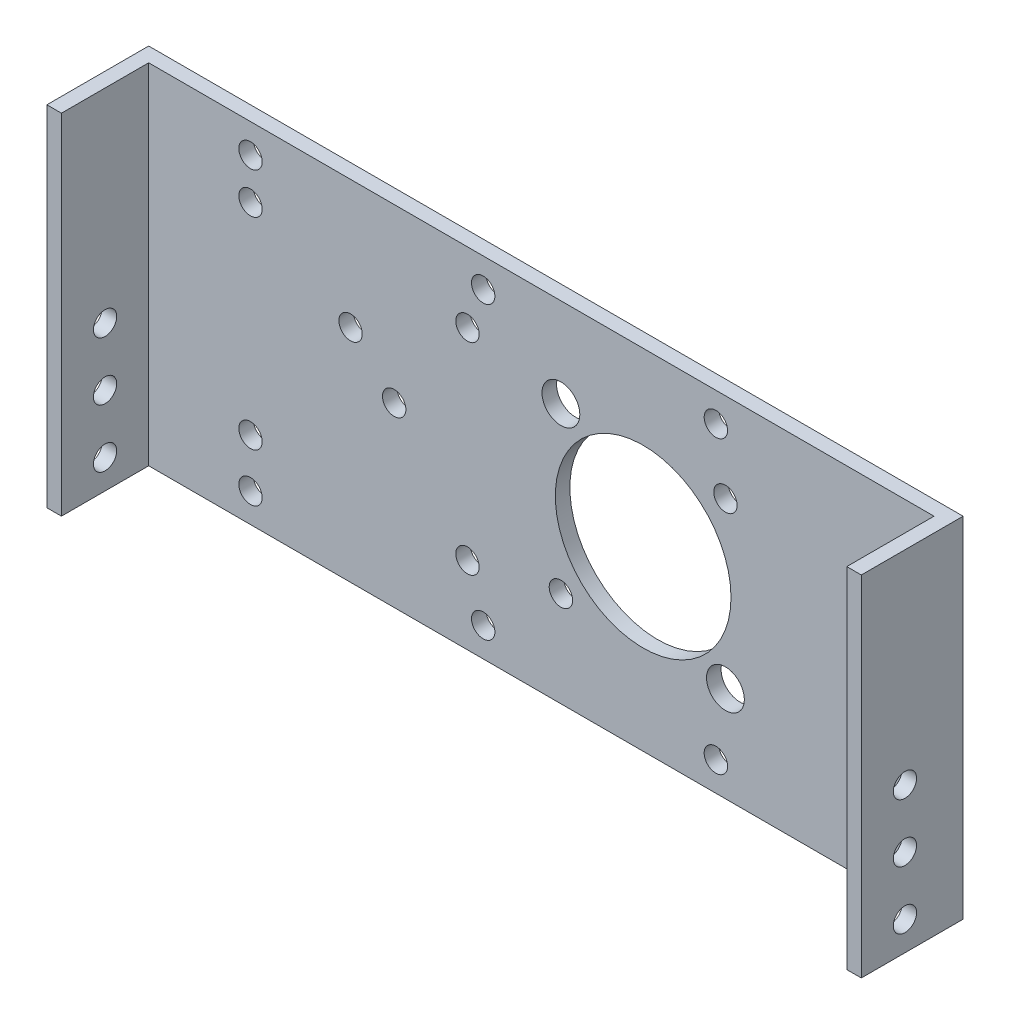
ISO-10303-21;
HEADER;
FILE_DESCRIPTION(('STEP AP214'),'2;1');
FILE_NAME('part.step','',(''),(''),'','','');
FILE_SCHEMA(('AUTOMOTIVE_DESIGN { 1 0 10303 214 1 1 1 1 }'));
ENDSEC;
DATA;
#1=APPLICATION_CONTEXT('core data for automotive mechanical design processes');
#2=APPLICATION_PROTOCOL_DEFINITION('international standard','automotive_design',2000,#1);
#3=PRODUCT_CONTEXT('',#1,'mechanical');
#4=PRODUCT('Part','Part','',(#3));
#5=PRODUCT_RELATED_PRODUCT_CATEGORY('part','',(#4));
#6=PRODUCT_DEFINITION_FORMATION('','',#4);
#7=PRODUCT_DEFINITION_CONTEXT('part definition',#1,'design');
#8=PRODUCT_DEFINITION('design','',#6,#7);
#9=PRODUCT_DEFINITION_SHAPE('','',#8);
#10=(LENGTH_UNIT() NAMED_UNIT(*) SI_UNIT(.MILLI.,.METRE.));
#11=(NAMED_UNIT(*) PLANE_ANGLE_UNIT() SI_UNIT($,.RADIAN.));
#12=(NAMED_UNIT(*) SI_UNIT($,.STERADIAN.) SOLID_ANGLE_UNIT());
#13=UNCERTAINTY_MEASURE_WITH_UNIT(LENGTH_MEASURE(1.E-05),#10,'distance_accuracy_value','');
#14=(GEOMETRIC_REPRESENTATION_CONTEXT(3) GLOBAL_UNCERTAINTY_ASSIGNED_CONTEXT((#13)) GLOBAL_UNIT_ASSIGNED_CONTEXT((#10,
#11,#12)) REPRESENTATION_CONTEXT('',''));
#15=CARTESIAN_POINT('',(0.,0.,0.));
#16=DIRECTION('',(0.,0.,1.));
#17=DIRECTION('',(1.,0.,0.));
#18=AXIS2_PLACEMENT_3D('',#15,#16,#17);
#19=CARTESIAN_POINT('',(0.,0.,3.175));
#20=DIRECTION('',(0.,0.,-1.));
#21=DIRECTION('',(-1.,0.,0.));
#22=AXIS2_PLACEMENT_3D('',#19,#20,#21);
#23=PLANE('',#22);
#24=CARTESIAN_POINT('',(89.5305412038619,9.85973484361682,3.175));
#25=DIRECTION('',(0.,0.,1.));
#26=DIRECTION('',(1.,0.,0.));
#27=AXIS2_PLACEMENT_3D('',#24,#25,#26);
#28=CIRCLE('',#27,2.55269999999998);
#29=CARTESIAN_POINT('',(92.0832412038618,9.85973484361682,3.175));
#30=VERTEX_POINT('',#29);
#31=EDGE_CURVE('E258',#30,#30,#28,.T.);
#32=ORIENTED_EDGE('',*,*,#31,.F.);
#33=EDGE_LOOP('',(#32));
#34=FACE_BOUND('',#33,.T.);
#35=CARTESIAN_POINT('',(-12.0694587961381,73.3597348436168,3.175));
#36=DIRECTION('',(0.,0.,1.));
#37=DIRECTION('',(1.,0.,0.));
#38=AXIS2_PLACEMENT_3D('',#35,#36,#37);
#39=CIRCLE('',#38,2.55269999999998);
#40=CARTESIAN_POINT('',(-9.51675879613814,73.3597348436168,3.175));
#41=VERTEX_POINT('',#40);
#42=EDGE_CURVE('E252',#41,#41,#39,.T.);
#43=ORIENTED_EDGE('',*,*,#42,.F.);
#44=EDGE_LOOP('',(#43));
#45=FACE_BOUND('',#44,.T.);
#46=CARTESIAN_POINT('',(-12.0694587961381,9.85973484361682,3.175));
#47=DIRECTION('',(0.,0.,1.));
#48=DIRECTION('',(1.,0.,0.));
#49=AXIS2_PLACEMENT_3D('',#46,#47,#48);
#50=CIRCLE('',#49,2.5527);
#51=CARTESIAN_POINT('',(-9.51675879613812,9.85973484361682,3.175));
#52=VERTEX_POINT('',#51);
#53=EDGE_CURVE('E246',#52,#52,#50,.T.);
#54=ORIENTED_EDGE('',*,*,#53,.F.);
#55=EDGE_LOOP('',(#54));
#56=FACE_BOUND('',#55,.T.);
#57=CARTESIAN_POINT('',(89.5305412038619,73.3597348436168,3.175));
#58=DIRECTION('',(0.,0.,1.));
#59=DIRECTION('',(1.,0.,0.));
#60=AXIS2_PLACEMENT_3D('',#57,#58,#59);
#61=CIRCLE('',#60,2.55269999999998);
#62=CARTESIAN_POINT('',(92.0832412038618,73.3597348436168,3.175));
#63=VERTEX_POINT('',#62);
#64=EDGE_CURVE('E240',#63,#63,#61,.T.);
#65=ORIENTED_EDGE('',*,*,#64,.F.);
#66=EDGE_LOOP('',(#65));
#67=FACE_BOUND('',#66,.T.);
#68=CARTESIAN_POINT('',(-12.0694587961381,64.4273950078619,3.175));
#69=DIRECTION('',(0.,0.,1.));
#70=DIRECTION('',(1.,0.,0.));
#71=AXIS2_PLACEMENT_3D('',#68,#69,#70);
#72=CIRCLE('',#71,2.55269999999999);
#73=CARTESIAN_POINT('',(-9.51675879613813,64.4273950078619,3.175));
#74=VERTEX_POINT('',#73);
#75=EDGE_CURVE('E234',#74,#74,#72,.T.);
#76=ORIENTED_EDGE('',*,*,#75,.F.);
#77=EDGE_LOOP('',(#76));
#78=FACE_BOUND('',#77,.T.);
#79=CARTESIAN_POINT('',(121.280541203862,42.2023950078619,3.175));
#80=DIRECTION('',(0.,0.,1.));
#81=DIRECTION('',(1.,0.,0.));
#82=AXIS2_PLACEMENT_3D('',#79,#80,#81);
#83=CIRCLE('',#82,2.55270000000003);
#84=CARTESIAN_POINT('',(123.833241203862,42.2023950078619,3.175));
#85=VERTEX_POINT('',#84);
#86=EDGE_CURVE('E228',#85,#85,#83,.T.);
#87=ORIENTED_EDGE('',*,*,#86,.F.);
#88=EDGE_LOOP('',(#87));
#89=FACE_BOUND('',#88,.T.);
#90=CARTESIAN_POINT('',(38.7305412038619,73.3597348436168,3.175));
#91=DIRECTION('',(0.,0.,1.));
#92=DIRECTION('',(1.,0.,0.));
#93=AXIS2_PLACEMENT_3D('',#90,#91,#92);
#94=CIRCLE('',#93,2.55269999999999);
#95=CARTESIAN_POINT('',(41.2832412038619,73.3597348436168,3.175));
#96=VERTEX_POINT('',#95);
#97=EDGE_CURVE('E222',#96,#96,#94,.T.);
#98=ORIENTED_EDGE('',*,*,#97,.F.);
#99=EDGE_LOOP('',(#98));
#100=FACE_BOUND('',#99,.T.);
#101=CARTESIAN_POINT('',(35.3015412038619,64.4273950078619,3.175));
#102=DIRECTION('',(0.,0.,1.));
#103=DIRECTION('',(1.,0.,0.));
#104=AXIS2_PLACEMENT_3D('',#101,#102,#103);
#105=CIRCLE('',#104,2.5527);
#106=CARTESIAN_POINT('',(37.8542412038619,64.4273950078619,3.175));
#107=VERTEX_POINT('',#106);
#108=EDGE_CURVE('E216',#107,#107,#105,.T.);
#109=ORIENTED_EDGE('',*,*,#108,.F.);
#110=EDGE_LOOP('',(#109));
#111=FACE_BOUND('',#110,.T.);
#112=CARTESIAN_POINT('',(9.77419288939169,51.7273950078619,3.175));
#113=DIRECTION('',(0.,0.,1.));
#114=DIRECTION('',(1.,0.,0.));
#115=AXIS2_PLACEMENT_3D('',#112,#113,#114);
#116=CIRCLE('',#115,2.5527);
#117=CARTESIAN_POINT('',(12.3268928893917,51.7273950078619,3.175));
#118=VERTEX_POINT('',#117);
#119=EDGE_CURVE('E210',#118,#118,#116,.T.);
#120=ORIENTED_EDGE('',*,*,#119,.F.);
#121=EDGE_LOOP('',(#120));
#122=FACE_BOUND('',#121,.T.);
#123=CARTESIAN_POINT('',(19.2991928893917,42.2023950078619,3.175));
#124=DIRECTION('',(0.,0.,1.));
#125=DIRECTION('',(1.,0.,0.));
#126=AXIS2_PLACEMENT_3D('',#123,#124,#125);
#127=CIRCLE('',#126,2.5527);
#128=CARTESIAN_POINT('',(21.8518928893917,42.2023950078619,3.175));
#129=VERTEX_POINT('',#128);
#130=EDGE_CURVE('E204',#129,#129,#127,.T.);
#131=ORIENTED_EDGE('',*,*,#130,.F.);
#132=EDGE_LOOP('',(#131));
#133=FACE_BOUND('',#132,.T.);
#134=CARTESIAN_POINT('',(-12.0694587961381,20.4336742758977,3.175));
#135=DIRECTION('',(0.,0.,1.));
#136=DIRECTION('',(1.,0.,0.));
#137=AXIS2_PLACEMENT_3D('',#134,#135,#136);
#138=CIRCLE('',#137,2.5527);
#139=CARTESIAN_POINT('',(-9.51675879613812,20.4336742758977,3.175));
#140=VERTEX_POINT('',#139);
#141=EDGE_CURVE('E198',#140,#140,#138,.T.);
#142=ORIENTED_EDGE('',*,*,#141,.F.);
#143=EDGE_LOOP('',(#142));
#144=FACE_BOUND('',#143,.T.);
#145=CARTESIAN_POINT('',(35.3015412038619,20.4336742758977,3.175));
#146=DIRECTION('',(0.,0.,1.));
#147=DIRECTION('',(1.,0.,0.));
#148=AXIS2_PLACEMENT_3D('',#145,#146,#147);
#149=CIRCLE('',#148,2.5527);
#150=CARTESIAN_POINT('',(37.8542412038619,20.4336742758977,3.175));
#151=VERTEX_POINT('',#150);
#152=EDGE_CURVE('E192',#151,#151,#149,.T.);
#153=ORIENTED_EDGE('',*,*,#152,.F.);
#154=EDGE_LOOP('',(#153));
#155=FACE_BOUND('',#154,.T.);
#156=CARTESIAN_POINT('',(38.7305412038619,9.85973484361682,3.175));
#157=DIRECTION('',(0.,0.,1.));
#158=DIRECTION('',(1.,0.,0.));
#159=AXIS2_PLACEMENT_3D('',#156,#157,#158);
#160=CIRCLE('',#159,2.5527);
#161=CARTESIAN_POINT('',(41.2832412038619,9.85973484361682,3.175));
#162=VERTEX_POINT('',#161);
#163=EDGE_CURVE('E186',#162,#162,#160,.T.);
#164=ORIENTED_EDGE('',*,*,#163,.F.);
#165=EDGE_LOOP('',(#164));
#166=FACE_BOUND('',#165,.T.);
#167=CARTESIAN_POINT('',(55.6950289617236,24.3331596898449,3.175));
#168=DIRECTION('',(0.,0.,1.));
#169=DIRECTION('',(1.,0.,0.));
#170=AXIS2_PLACEMENT_3D('',#167,#168,#169);
#171=CIRCLE('',#170,2.5527);
#172=CARTESIAN_POINT('',(58.2477289617236,24.3331596898449,3.175));
#173=VERTEX_POINT('',#172);
#174=EDGE_CURVE('E180',#173,#173,#171,.T.);
#175=ORIENTED_EDGE('',*,*,#174,.F.);
#176=EDGE_LOOP('',(#175));
#177=FACE_BOUND('',#176,.T.);
#178=CARTESIAN_POINT('',(55.6950289617236,60.2541841741216,3.175));
#179=DIRECTION('',(0.,0.,1.));
#180=DIRECTION('',(1.,0.,0.));
#181=AXIS2_PLACEMENT_3D('',#178,#179,#180);
#182=CIRCLE('',#181,4.1275);
#183=CARTESIAN_POINT('',(59.8225289617236,60.2541841741216,3.175));
#184=VERTEX_POINT('',#183);
#185=EDGE_CURVE('E174',#184,#184,#182,.T.);
#186=ORIENTED_EDGE('',*,*,#185,.F.);
#187=EDGE_LOOP('',(#186));
#188=FACE_BOUND('',#187,.T.);
#189=CARTESIAN_POINT('',(91.6160534460001,60.2541841741216,3.175));
#190=DIRECTION('',(0.,0.,1.));
#191=DIRECTION('',(1.,0.,0.));
#192=AXIS2_PLACEMENT_3D('',#189,#190,#191);
#193=CIRCLE('',#192,2.5527);
#194=CARTESIAN_POINT('',(94.1687534460001,60.2541841741216,3.175));
#195=VERTEX_POINT('',#194);
#196=EDGE_CURVE('E168',#195,#195,#193,.T.);
#197=ORIENTED_EDGE('',*,*,#196,.F.);
#198=EDGE_LOOP('',(#197));
#199=FACE_BOUND('',#198,.T.);
#200=CARTESIAN_POINT('',(91.6160534460001,24.3331596898449,3.175));
#201=DIRECTION('',(0.,0.,1.));
#202=DIRECTION('',(1.,0.,0.));
#203=AXIS2_PLACEMENT_3D('',#200,#201,#202);
#204=CIRCLE('',#203,4.12749999999999);
#205=CARTESIAN_POINT('',(95.7435534460001,24.3331596898449,3.175));
#206=VERTEX_POINT('',#205);
#207=EDGE_CURVE('E162',#206,#206,#204,.T.);
#208=ORIENTED_EDGE('',*,*,#207,.F.);
#209=EDGE_LOOP('',(#208));
#210=FACE_BOUND('',#209,.T.);
#211=CARTESIAN_POINT('',(73.6555412038619,42.2023950078619,3.175));
#212=DIRECTION('',(0.,0.,1.));
#213=DIRECTION('',(1.,0.,0.));
#214=AXIS2_PLACEMENT_3D('',#211,#212,#213);
#215=CIRCLE('',#214,19.177);
#216=CARTESIAN_POINT('',(92.8325412038619,42.2023950078619,3.175));
#217=VERTEX_POINT('',#216);
#218=EDGE_CURVE('E156',#217,#217,#215,.T.);
#219=ORIENTED_EDGE('',*,*,#218,.F.);
#220=EDGE_LOOP('',(#219));
#221=FACE_BOUND('',#220,.T.);
#222=DIRECTION('',(0.,-1.,0.));
#223=VECTOR('',#222,1.);
#224=CARTESIAN_POINT('',(137.155541203862,79.7097348436168,3.175));
#225=LINE('',#224,#223);
#226=CARTESIAN_POINT('',(137.155541203862,79.7097348436168,3.175));
#227=VERTEX_POINT('',#226);
#228=CARTESIAN_POINT('',(137.155541203862,3.50973484361682,3.175));
#229=VERTEX_POINT('',#228);
#230=EDGE_CURVE('E116',#227,#229,#225,.T.);
#231=ORIENTED_EDGE('',*,*,#230,.F.);
#232=DIRECTION('',(-1.,0.,0.));
#233=VECTOR('',#232,1.);
#234=CARTESIAN_POINT('',(-37.4694587961381,79.7097348436168,3.175));
#235=LINE('',#234,#233);
#236=CARTESIAN_POINT('',(-34.2944587961381,79.7097348436168,3.175));
#237=VERTEX_POINT('',#236);
#238=EDGE_CURVE('E105',#227,#237,#235,.T.);
#239=ORIENTED_EDGE('',*,*,#238,.T.);
#240=DIRECTION('',(0.,1.,0.));
#241=VECTOR('',#240,1.);
#242=CARTESIAN_POINT('',(-34.2944587961381,79.7097348436168,3.175));
#243=LINE('',#242,#241);
#244=CARTESIAN_POINT('',(-34.2944587961381,3.50973484361682,3.175));
#245=VERTEX_POINT('',#244);
#246=EDGE_CURVE('E61',#245,#237,#243,.T.);
#247=ORIENTED_EDGE('',*,*,#246,.F.);
#248=DIRECTION('',(1.,0.,0.));
#249=VECTOR('',#248,1.);
#250=CARTESIAN_POINT('',(-37.4694587961381,3.50973484361682,3.175));
#251=LINE('',#250,#249);
#252=EDGE_CURVE('E56',#245,#229,#251,.T.);
#253=ORIENTED_EDGE('',*,*,#252,.T.);
#254=EDGE_LOOP('',(#231,#239,#247,#253));
#255=FACE_BOUND('',#254,.T.);
#256=ADVANCED_FACE('F39',(#34,#45,#56,#67,#78,#89,#100,#111,#122,#133,#144,#155,#166,#177,#188,
#199,#210,#221,#255),#23,.F.);
#257=CARTESIAN_POINT('',(0.,0.,0.));
#258=DIRECTION('',(0.,0.,-1.));
#259=DIRECTION('',(-1.,0.,0.));
#260=AXIS2_PLACEMENT_3D('',#257,#258,#259);
#261=PLANE('',#260);
#262=CARTESIAN_POINT('',(91.6160534460001,24.3331596898449,0.));
#263=DIRECTION('',(0.,0.,1.));
#264=DIRECTION('',(1.,0.,0.));
#265=AXIS2_PLACEMENT_3D('',#262,#263,#264);
#266=CIRCLE('',#265,4.12749999999999);
#267=CARTESIAN_POINT('',(95.7435534460001,24.3331596898449,0.));
#268=VERTEX_POINT('',#267);
#269=EDGE_CURVE('E159',#268,#268,#266,.T.);
#270=ORIENTED_EDGE('',*,*,#269,.T.);
#271=EDGE_LOOP('',(#270));
#272=FACE_BOUND('',#271,.T.);
#273=CARTESIAN_POINT('',(55.6950289617236,60.2541841741216,0.));
#274=DIRECTION('',(0.,0.,1.));
#275=DIRECTION('',(1.,0.,0.));
#276=AXIS2_PLACEMENT_3D('',#273,#274,#275);
#277=CIRCLE('',#276,4.1275);
#278=CARTESIAN_POINT('',(59.8225289617236,60.2541841741216,0.));
#279=VERTEX_POINT('',#278);
#280=EDGE_CURVE('E171',#279,#279,#277,.T.);
#281=ORIENTED_EDGE('',*,*,#280,.T.);
#282=EDGE_LOOP('',(#281));
#283=FACE_BOUND('',#282,.T.);
#284=CARTESIAN_POINT('',(38.7305412038619,9.85973484361682,0.));
#285=DIRECTION('',(0.,0.,1.));
#286=DIRECTION('',(1.,0.,0.));
#287=AXIS2_PLACEMENT_3D('',#284,#285,#286);
#288=CIRCLE('',#287,2.5527);
#289=CARTESIAN_POINT('',(41.2832412038619,9.85973484361682,0.));
#290=VERTEX_POINT('',#289);
#291=EDGE_CURVE('E183',#290,#290,#288,.T.);
#292=ORIENTED_EDGE('',*,*,#291,.T.);
#293=EDGE_LOOP('',(#292));
#294=FACE_BOUND('',#293,.T.);
#295=CARTESIAN_POINT('',(-12.0694587961381,20.4336742758977,0.));
#296=DIRECTION('',(0.,0.,1.));
#297=DIRECTION('',(1.,0.,0.));
#298=AXIS2_PLACEMENT_3D('',#295,#296,#297);
#299=CIRCLE('',#298,2.5527);
#300=CARTESIAN_POINT('',(-9.51675879613812,20.4336742758977,0.));
#301=VERTEX_POINT('',#300);
#302=EDGE_CURVE('E195',#301,#301,#299,.T.);
#303=ORIENTED_EDGE('',*,*,#302,.T.);
#304=EDGE_LOOP('',(#303));
#305=FACE_BOUND('',#304,.T.);
#306=CARTESIAN_POINT('',(9.77419288939169,51.7273950078619,0.));
#307=DIRECTION('',(0.,0.,1.));
#308=DIRECTION('',(1.,0.,0.));
#309=AXIS2_PLACEMENT_3D('',#306,#307,#308);
#310=CIRCLE('',#309,2.5527);
#311=CARTESIAN_POINT('',(12.3268928893917,51.7273950078619,0.));
#312=VERTEX_POINT('',#311);
#313=EDGE_CURVE('E207',#312,#312,#310,.T.);
#314=ORIENTED_EDGE('',*,*,#313,.T.);
#315=EDGE_LOOP('',(#314));
#316=FACE_BOUND('',#315,.T.);
#317=CARTESIAN_POINT('',(38.7305412038619,73.3597348436168,0.));
#318=DIRECTION('',(0.,0.,1.));
#319=DIRECTION('',(1.,0.,0.));
#320=AXIS2_PLACEMENT_3D('',#317,#318,#319);
#321=CIRCLE('',#320,2.55269999999999);
#322=CARTESIAN_POINT('',(41.2832412038619,73.3597348436168,0.));
#323=VERTEX_POINT('',#322);
#324=EDGE_CURVE('E219',#323,#323,#321,.T.);
#325=ORIENTED_EDGE('',*,*,#324,.T.);
#326=EDGE_LOOP('',(#325));
#327=FACE_BOUND('',#326,.T.);
#328=CARTESIAN_POINT('',(-12.0694587961381,64.4273950078619,0.));
#329=DIRECTION('',(0.,0.,1.));
#330=DIRECTION('',(1.,0.,0.));
#331=AXIS2_PLACEMENT_3D('',#328,#329,#330);
#332=CIRCLE('',#331,2.55269999999999);
#333=CARTESIAN_POINT('',(-9.51675879613813,64.4273950078619,0.));
#334=VERTEX_POINT('',#333);
#335=EDGE_CURVE('E231',#334,#334,#332,.T.);
#336=ORIENTED_EDGE('',*,*,#335,.T.);
#337=EDGE_LOOP('',(#336));
#338=FACE_BOUND('',#337,.T.);
#339=CARTESIAN_POINT('',(-12.0694587961381,9.85973484361682,0.));
#340=DIRECTION('',(0.,0.,1.));
#341=DIRECTION('',(1.,0.,0.));
#342=AXIS2_PLACEMENT_3D('',#339,#340,#341);
#343=CIRCLE('',#342,2.5527);
#344=CARTESIAN_POINT('',(-9.51675879613812,9.85973484361682,0.));
#345=VERTEX_POINT('',#344);
#346=EDGE_CURVE('E243',#345,#345,#343,.T.);
#347=ORIENTED_EDGE('',*,*,#346,.T.);
#348=EDGE_LOOP('',(#347));
#349=FACE_BOUND('',#348,.T.);
#350=CARTESIAN_POINT('',(89.5305412038619,9.85973484361682,0.));
#351=DIRECTION('',(0.,0.,1.));
#352=DIRECTION('',(1.,0.,0.));
#353=AXIS2_PLACEMENT_3D('',#350,#351,#352);
#354=CIRCLE('',#353,2.55269999999998);
#355=CARTESIAN_POINT('',(92.0832412038618,9.85973484361682,0.));
#356=VERTEX_POINT('',#355);
#357=EDGE_CURVE('E255',#356,#356,#354,.T.);
#358=ORIENTED_EDGE('',*,*,#357,.T.);
#359=EDGE_LOOP('',(#358));
#360=FACE_BOUND('',#359,.T.);
#361=DIRECTION('',(1.,0.,0.));
#362=VECTOR('',#361,1.);
#363=CARTESIAN_POINT('',(-37.4694587961381,3.50973484361682,0.));
#364=LINE('',#363,#362);
#365=CARTESIAN_POINT('',(-37.4694587961381,3.50973484361682,0.));
#366=VERTEX_POINT('',#365);
#367=CARTESIAN_POINT('',(140.330541203862,3.50973484361682,0.));
#368=VERTEX_POINT('',#367);
#369=EDGE_CURVE('E261',#366,#368,#364,.T.);
#370=ORIENTED_EDGE('',*,*,#369,.F.);
#371=DIRECTION('',(0.,-1.,0.));
#372=VECTOR('',#371,1.);
#373=CARTESIAN_POINT('',(-37.4694587961381,3.50973484361682,0.));
#374=LINE('',#373,#372);
#375=CARTESIAN_POINT('',(-37.4694587961381,79.7097348436168,0.));
#376=VERTEX_POINT('',#375);
#377=EDGE_CURVE('E264',#376,#366,#374,.T.);
#378=ORIENTED_EDGE('',*,*,#377,.F.);
#379=DIRECTION('',(-1.,0.,0.));
#380=VECTOR('',#379,1.);
#381=CARTESIAN_POINT('',(-37.4694587961381,79.7097348436168,0.));
#382=LINE('',#381,#380);
#383=CARTESIAN_POINT('',(140.330541203862,79.7097348436168,0.));
#384=VERTEX_POINT('',#383);
#385=EDGE_CURVE('E270',#384,#376,#382,.T.);
#386=ORIENTED_EDGE('',*,*,#385,.F.);
#387=DIRECTION('',(0.,1.,0.));
#388=VECTOR('',#387,1.);
#389=CARTESIAN_POINT('',(140.330541203862,79.7097348436168,0.));
#390=LINE('',#389,#388);
#391=EDGE_CURVE('E268',#368,#384,#390,.T.);
#392=ORIENTED_EDGE('',*,*,#391,.F.);
#393=EDGE_LOOP('',(#370,#378,#386,#392));
#394=FACE_BOUND('',#393,.T.);
#395=CARTESIAN_POINT('',(-12.0694587961381,73.3597348436168,0.));
#396=DIRECTION('',(0.,0.,1.));
#397=DIRECTION('',(1.,0.,0.));
#398=AXIS2_PLACEMENT_3D('',#395,#396,#397);
#399=CIRCLE('',#398,2.55269999999998);
#400=CARTESIAN_POINT('',(-9.51675879613814,73.3597348436168,0.));
#401=VERTEX_POINT('',#400);
#402=EDGE_CURVE('E249',#401,#401,#399,.T.);
#403=ORIENTED_EDGE('',*,*,#402,.T.);
#404=EDGE_LOOP('',(#403));
#405=FACE_BOUND('',#404,.T.);
#406=CARTESIAN_POINT('',(89.5305412038619,73.3597348436168,0.));
#407=DIRECTION('',(0.,0.,1.));
#408=DIRECTION('',(1.,0.,0.));
#409=AXIS2_PLACEMENT_3D('',#406,#407,#408);
#410=CIRCLE('',#409,2.55269999999998);
#411=CARTESIAN_POINT('',(92.0832412038618,73.3597348436168,0.));
#412=VERTEX_POINT('',#411);
#413=EDGE_CURVE('E237',#412,#412,#410,.T.);
#414=ORIENTED_EDGE('',*,*,#413,.T.);
#415=EDGE_LOOP('',(#414));
#416=FACE_BOUND('',#415,.T.);
#417=CARTESIAN_POINT('',(121.280541203862,42.2023950078619,0.));
#418=DIRECTION('',(0.,0.,1.));
#419=DIRECTION('',(1.,0.,0.));
#420=AXIS2_PLACEMENT_3D('',#417,#418,#419);
#421=CIRCLE('',#420,2.55270000000003);
#422=CARTESIAN_POINT('',(123.833241203862,42.2023950078619,0.));
#423=VERTEX_POINT('',#422);
#424=EDGE_CURVE('E225',#423,#423,#421,.T.);
#425=ORIENTED_EDGE('',*,*,#424,.T.);
#426=EDGE_LOOP('',(#425));
#427=FACE_BOUND('',#426,.T.);
#428=CARTESIAN_POINT('',(35.3015412038619,64.4273950078619,0.));
#429=DIRECTION('',(0.,0.,1.));
#430=DIRECTION('',(1.,0.,0.));
#431=AXIS2_PLACEMENT_3D('',#428,#429,#430);
#432=CIRCLE('',#431,2.5527);
#433=CARTESIAN_POINT('',(37.8542412038619,64.4273950078619,0.));
#434=VERTEX_POINT('',#433);
#435=EDGE_CURVE('E213',#434,#434,#432,.T.);
#436=ORIENTED_EDGE('',*,*,#435,.T.);
#437=EDGE_LOOP('',(#436));
#438=FACE_BOUND('',#437,.T.);
#439=CARTESIAN_POINT('',(19.2991928893917,42.2023950078619,0.));
#440=DIRECTION('',(0.,0.,1.));
#441=DIRECTION('',(1.,0.,0.));
#442=AXIS2_PLACEMENT_3D('',#439,#440,#441);
#443=CIRCLE('',#442,2.5527);
#444=CARTESIAN_POINT('',(21.8518928893917,42.2023950078619,0.));
#445=VERTEX_POINT('',#444);
#446=EDGE_CURVE('E201',#445,#445,#443,.T.);
#447=ORIENTED_EDGE('',*,*,#446,.T.);
#448=EDGE_LOOP('',(#447));
#449=FACE_BOUND('',#448,.T.);
#450=CARTESIAN_POINT('',(35.3015412038619,20.4336742758977,0.));
#451=DIRECTION('',(0.,0.,1.));
#452=DIRECTION('',(1.,0.,0.));
#453=AXIS2_PLACEMENT_3D('',#450,#451,#452);
#454=CIRCLE('',#453,2.5527);
#455=CARTESIAN_POINT('',(37.8542412038619,20.4336742758977,0.));
#456=VERTEX_POINT('',#455);
#457=EDGE_CURVE('E189',#456,#456,#454,.T.);
#458=ORIENTED_EDGE('',*,*,#457,.T.);
#459=EDGE_LOOP('',(#458));
#460=FACE_BOUND('',#459,.T.);
#461=CARTESIAN_POINT('',(55.6950289617236,24.3331596898449,0.));
#462=DIRECTION('',(0.,0.,1.));
#463=DIRECTION('',(1.,0.,0.));
#464=AXIS2_PLACEMENT_3D('',#461,#462,#463);
#465=CIRCLE('',#464,2.5527);
#466=CARTESIAN_POINT('',(58.2477289617236,24.3331596898449,0.));
#467=VERTEX_POINT('',#466);
#468=EDGE_CURVE('E177',#467,#467,#465,.T.);
#469=ORIENTED_EDGE('',*,*,#468,.T.);
#470=EDGE_LOOP('',(#469));
#471=FACE_BOUND('',#470,.T.);
#472=CARTESIAN_POINT('',(91.6160534460001,60.2541841741216,0.));
#473=DIRECTION('',(0.,0.,1.));
#474=DIRECTION('',(1.,0.,0.));
#475=AXIS2_PLACEMENT_3D('',#472,#473,#474);
#476=CIRCLE('',#475,2.5527);
#477=CARTESIAN_POINT('',(94.1687534460001,60.2541841741216,0.));
#478=VERTEX_POINT('',#477);
#479=EDGE_CURVE('E165',#478,#478,#476,.T.);
#480=ORIENTED_EDGE('',*,*,#479,.T.);
#481=EDGE_LOOP('',(#480));
#482=FACE_BOUND('',#481,.T.);
#483=CARTESIAN_POINT('',(73.6555412038619,42.2023950078619,0.));
#484=DIRECTION('',(0.,0.,1.));
#485=DIRECTION('',(1.,0.,0.));
#486=AXIS2_PLACEMENT_3D('',#483,#484,#485);
#487=CIRCLE('',#486,19.177);
#488=CARTESIAN_POINT('',(92.8325412038619,42.2023950078619,0.));
#489=VERTEX_POINT('',#488);
#490=EDGE_CURVE('E155',#489,#489,#487,.T.);
#491=ORIENTED_EDGE('',*,*,#490,.T.);
#492=EDGE_LOOP('',(#491));
#493=FACE_BOUND('',#492,.T.);
#494=ADVANCED_FACE('F346',(#272,#283,#294,#305,#316,#327,#338,#349,#360,#394,#405,#416,#427,
#438,#449,#460,#471,#482,#493),#261,.T.);
#495=CARTESIAN_POINT('',(-37.4694587961381,3.50973484361682,3.175));
#496=DIRECTION('',(0.,1.,0.));
#497=DIRECTION('',(-1.,0.,0.));
#498=AXIS2_PLACEMENT_3D('',#495,#496,#497);
#499=PLANE('',#498);
#500=ORIENTED_EDGE('',*,*,#369,.T.);
#501=DIRECTION('',(0.,0.,-1.));
#502=VECTOR('',#501,1.);
#503=CARTESIAN_POINT('',(140.330541203862,3.50973484361682,3.175));
#504=LINE('',#503,#502);
#505=CARTESIAN_POINT('',(140.330541203862,3.50973484361682,22.225));
#506=VERTEX_POINT('',#505);
#507=EDGE_CURVE('E11',#506,#368,#504,.T.);
#508=ORIENTED_EDGE('',*,*,#507,.F.);
#509=DIRECTION('',(1.,0.,0.));
#510=VECTOR('',#509,1.);
#511=CARTESIAN_POINT('',(140.330541203862,3.50973484361682,22.225));
#512=LINE('',#511,#510);
#513=CARTESIAN_POINT('',(137.155541203862,3.50973484361682,22.225));
#514=VERTEX_POINT('',#513);
#515=EDGE_CURVE('E127',#514,#506,#512,.T.);
#516=ORIENTED_EDGE('',*,*,#515,.F.);
#517=DIRECTION('',(0.,0.,-1.));
#518=VECTOR('',#517,1.);
#519=CARTESIAN_POINT('',(137.155541203862,3.50973484361682,22.225));
#520=LINE('',#519,#518);
#521=EDGE_CURVE('E124',#514,#229,#520,.T.);
#522=ORIENTED_EDGE('',*,*,#521,.T.);
#523=ORIENTED_EDGE('',*,*,#252,.F.);
#524=DIRECTION('',(0.,0.,-1.));
#525=VECTOR('',#524,1.);
#526=CARTESIAN_POINT('',(-34.2944587961381,3.50973484361682,22.225));
#527=LINE('',#526,#525);
#528=CARTESIAN_POINT('',(-34.2944587961381,3.50973484361682,22.225));
#529=VERTEX_POINT('',#528);
#530=EDGE_CURVE('E152',#529,#245,#527,.T.);
#531=ORIENTED_EDGE('',*,*,#530,.F.);
#532=DIRECTION('',(1.,0.,0.));
#533=VECTOR('',#532,1.);
#534=CARTESIAN_POINT('',(-37.4694587961381,3.50973484361682,22.225));
#535=LINE('',#534,#533);
#536=CARTESIAN_POINT('',(-37.4694587961381,3.50973484361682,22.225));
#537=VERTEX_POINT('',#536);
#538=EDGE_CURVE('E143',#537,#529,#535,.T.);
#539=ORIENTED_EDGE('',*,*,#538,.F.);
#540=DIRECTION('',(0.,0.,-1.));
#541=VECTOR('',#540,1.);
#542=CARTESIAN_POINT('',(-37.4694587961381,3.50973484361682,3.175));
#543=LINE('',#542,#541);
#544=EDGE_CURVE('E114',#537,#366,#543,.T.);
#545=ORIENTED_EDGE('',*,*,#544,.T.);
#546=EDGE_LOOP('',(#500,#508,#516,#522,#523,#531,#539,#545));
#547=FACE_BOUND('',#546,.T.);
#548=ADVANCED_FACE('F41',(#547),#499,.F.);
#549=CARTESIAN_POINT('',(140.330541203862,79.7097348436168,3.175));
#550=DIRECTION('',(-1.,0.,0.));
#551=DIRECTION('',(0.,0.,1.));
#552=AXIS2_PLACEMENT_3D('',#549,#550,#551);
#553=PLANE('',#552);
#554=CARTESIAN_POINT('',(140.330541203862,35.2597348436168,12.7));
#555=DIRECTION('',(1.,0.,0.));
#556=DIRECTION('',(0.,0.,-1.));
#557=AXIS2_PLACEMENT_3D('',#554,#555,#556);
#558=CIRCLE('',#557,2.54);
#559=CARTESIAN_POINT('',(140.330541203862,35.2597348436168,10.16));
#560=VERTEX_POINT('',#559);
#561=EDGE_CURVE('E307',#560,#560,#558,.T.);
#562=ORIENTED_EDGE('',*,*,#561,.F.);
#563=EDGE_LOOP('',(#562));
#564=FACE_BOUND('',#563,.T.);
#565=CARTESIAN_POINT('',(140.330541203862,22.5597348436168,12.7));
#566=DIRECTION('',(1.,0.,0.));
#567=DIRECTION('',(0.,0.,-1.));
#568=AXIS2_PLACEMENT_3D('',#565,#566,#567);
#569=CIRCLE('',#568,2.54);
#570=CARTESIAN_POINT('',(140.330541203862,22.5597348436168,10.16));
#571=VERTEX_POINT('',#570);
#572=EDGE_CURVE('E304',#571,#571,#569,.T.);
#573=ORIENTED_EDGE('',*,*,#572,.F.);
#574=EDGE_LOOP('',(#573));
#575=FACE_BOUND('',#574,.T.);
#576=CARTESIAN_POINT('',(140.330541203862,9.85973484361682,12.7));
#577=DIRECTION('',(1.,0.,0.));
#578=DIRECTION('',(0.,0.,-1.));
#579=AXIS2_PLACEMENT_3D('',#576,#577,#578);
#580=CIRCLE('',#579,2.54);
#581=CARTESIAN_POINT('',(140.330541203862,9.85973484361682,10.16));
#582=VERTEX_POINT('',#581);
#583=EDGE_CURVE('E298',#582,#582,#580,.T.);
#584=ORIENTED_EDGE('',*,*,#583,.F.);
#585=EDGE_LOOP('',(#584));
#586=FACE_BOUND('',#585,.T.);
#587=ORIENTED_EDGE('',*,*,#391,.T.);
#588=DIRECTION('',(0.,0.,-1.));
#589=VECTOR('',#588,1.);
#590=CARTESIAN_POINT('',(140.330541203862,79.7097348436168,3.175));
#591=LINE('',#590,#589);
#592=CARTESIAN_POINT('',(140.330541203862,79.7097348436168,22.225));
#593=VERTEX_POINT('',#592);
#594=EDGE_CURVE('E48',#593,#384,#591,.T.);
#595=ORIENTED_EDGE('',*,*,#594,.F.);
#596=DIRECTION('',(0.,1.,0.));
#597=VECTOR('',#596,1.);
#598=CARTESIAN_POINT('',(140.330541203862,79.7097348436168,22.225));
#599=LINE('',#598,#597);
#600=EDGE_CURVE('E120',#506,#593,#599,.T.);
#601=ORIENTED_EDGE('',*,*,#600,.F.);
#602=ORIENTED_EDGE('',*,*,#507,.T.);
#603=EDGE_LOOP('',(#587,#595,#601,#602));
#604=FACE_BOUND('',#603,.T.);
#605=ADVANCED_FACE('F341',(#564,#575,#586,#604),#553,.F.);
#606=CARTESIAN_POINT('',(-37.4694587961381,79.7097348436168,3.175));
#607=DIRECTION('',(0.,-1.,0.));
#608=DIRECTION('',(0.,0.,-1.));
#609=AXIS2_PLACEMENT_3D('',#606,#607,#608);
#610=PLANE('',#609);
#611=ORIENTED_EDGE('',*,*,#385,.T.);
#612=DIRECTION('',(0.,0.,-1.));
#613=VECTOR('',#612,1.);
#614=CARTESIAN_POINT('',(-37.4694587961381,79.7097348436168,3.175));
#615=LINE('',#614,#613);
#616=CARTESIAN_POINT('',(-37.4694587961381,79.7097348436168,22.225));
#617=VERTEX_POINT('',#616);
#618=EDGE_CURVE('E275',#617,#376,#615,.T.);
#619=ORIENTED_EDGE('',*,*,#618,.F.);
#620=DIRECTION('',(-1.,0.,0.));
#621=VECTOR('',#620,1.);
#622=CARTESIAN_POINT('',(-37.4694587961381,79.7097348436168,22.225));
#623=LINE('',#622,#621);
#624=CARTESIAN_POINT('',(-34.2944587961381,79.7097348436168,22.225));
#625=VERTEX_POINT('',#624);
#626=EDGE_CURVE('E147',#625,#617,#623,.T.);
#627=ORIENTED_EDGE('',*,*,#626,.F.);
#628=DIRECTION('',(0.,0.,-1.));
#629=VECTOR('',#628,1.);
#630=CARTESIAN_POINT('',(-34.2944587961381,79.7097348436168,22.225));
#631=LINE('',#630,#629);
#632=EDGE_CURVE('E113',#625,#237,#631,.T.);
#633=ORIENTED_EDGE('',*,*,#632,.T.);
#634=ORIENTED_EDGE('',*,*,#238,.F.);
#635=DIRECTION('',(0.,0.,-1.));
#636=VECTOR('',#635,1.);
#637=CARTESIAN_POINT('',(137.155541203862,79.7097348436168,22.225));
#638=LINE('',#637,#636);
#639=CARTESIAN_POINT('',(137.155541203862,79.7097348436168,22.225));
#640=VERTEX_POINT('',#639);
#641=EDGE_CURVE('E109',#640,#227,#638,.T.);
#642=ORIENTED_EDGE('',*,*,#641,.F.);
#643=DIRECTION('',(-1.,0.,0.));
#644=VECTOR('',#643,1.);
#645=CARTESIAN_POINT('',(140.330541203862,79.7097348436168,22.225));
#646=LINE('',#645,#644);
#647=EDGE_CURVE('E136',#593,#640,#646,.T.);
#648=ORIENTED_EDGE('',*,*,#647,.F.);
#649=ORIENTED_EDGE('',*,*,#594,.T.);
#650=EDGE_LOOP('',(#611,#619,#627,#633,#634,#642,#648,#649));
#651=FACE_BOUND('',#650,.T.);
#652=ADVANCED_FACE('F106',(#651),#610,.F.);
#653=CARTESIAN_POINT('',(-37.4694587961381,3.50973484361682,3.175));
#654=DIRECTION('',(1.,0.,0.));
#655=DIRECTION('',(0.,0.,-1.));
#656=AXIS2_PLACEMENT_3D('',#653,#654,#655);
#657=PLANE('',#656);
#658=CARTESIAN_POINT('',(-37.4694587961381,35.2597348436168,12.7));
#659=DIRECTION('',(1.,0.,0.));
#660=DIRECTION('',(0.,0.,-1.));
#661=AXIS2_PLACEMENT_3D('',#658,#659,#660);
#662=CIRCLE('',#661,2.54);
#663=CARTESIAN_POINT('',(-37.4694587961381,35.2597348436168,10.16));
#664=VERTEX_POINT('',#663);
#665=EDGE_CURVE('E283',#664,#664,#662,.T.);
#666=ORIENTED_EDGE('',*,*,#665,.T.);
#667=EDGE_LOOP('',(#666));
#668=FACE_BOUND('',#667,.T.);
#669=CARTESIAN_POINT('',(-37.4694587961381,22.5597348436168,12.7));
#670=DIRECTION('',(1.,0.,0.));
#671=DIRECTION('',(0.,0.,-1.));
#672=AXIS2_PLACEMENT_3D('',#669,#670,#671);
#673=CIRCLE('',#672,2.54);
#674=CARTESIAN_POINT('',(-37.4694587961381,22.5597348436168,10.16));
#675=VERTEX_POINT('',#674);
#676=EDGE_CURVE('E301',#675,#675,#673,.T.);
#677=ORIENTED_EDGE('',*,*,#676,.T.);
#678=EDGE_LOOP('',(#677));
#679=FACE_BOUND('',#678,.T.);
#680=CARTESIAN_POINT('',(-37.4694587961381,9.85973484361682,12.7));
#681=DIRECTION('',(1.,0.,0.));
#682=DIRECTION('',(0.,0.,-1.));
#683=AXIS2_PLACEMENT_3D('',#680,#681,#682);
#684=CIRCLE('',#683,2.54);
#685=CARTESIAN_POINT('',(-37.4694587961381,9.85973484361682,10.16));
#686=VERTEX_POINT('',#685);
#687=EDGE_CURVE('E295',#686,#686,#684,.T.);
#688=ORIENTED_EDGE('',*,*,#687,.T.);
#689=EDGE_LOOP('',(#688));
#690=FACE_BOUND('',#689,.T.);
#691=ORIENTED_EDGE('',*,*,#377,.T.);
#692=ORIENTED_EDGE('',*,*,#544,.F.);
#693=DIRECTION('',(0.,-1.,0.));
#694=VECTOR('',#693,1.);
#695=CARTESIAN_POINT('',(-37.4694587961381,79.7097348436168,22.225));
#696=LINE('',#695,#694);
#697=EDGE_CURVE('E140',#617,#537,#696,.T.);
#698=ORIENTED_EDGE('',*,*,#697,.F.);
#699=ORIENTED_EDGE('',*,*,#618,.T.);
#700=EDGE_LOOP('',(#691,#692,#698,#699));
#701=FACE_BOUND('',#700,.T.);
#702=ADVANCED_FACE('F313',(#668,#679,#690,#701),#657,.F.);
#703=CARTESIAN_POINT('',(89.5305412038619,9.85973484361682,3.175));
#704=DIRECTION('',(0.,0.,-1.));
#705=DIRECTION('',(-1.,0.,0.));
#706=AXIS2_PLACEMENT_3D('',#703,#704,#705);
#707=CYLINDRICAL_SURFACE('',#706,2.55269999999998);
#708=ORIENTED_EDGE('',*,*,#31,.T.);
#709=EDGE_LOOP('',(#708));
#710=FACE_BOUND('',#709,.T.);
#711=ORIENTED_EDGE('',*,*,#357,.F.);
#712=EDGE_LOOP('',(#711));
#713=FACE_BOUND('',#712,.T.);
#714=ADVANCED_FACE('F374',(#710,#713),#707,.F.);
#715=CARTESIAN_POINT('',(-12.0694587961381,73.3597348436168,3.175));
#716=DIRECTION('',(0.,0.,-1.));
#717=DIRECTION('',(-1.,0.,0.));
#718=AXIS2_PLACEMENT_3D('',#715,#716,#717);
#719=CYLINDRICAL_SURFACE('',#718,2.55269999999998);
#720=ORIENTED_EDGE('',*,*,#42,.T.);
#721=EDGE_LOOP('',(#720));
#722=FACE_BOUND('',#721,.T.);
#723=ORIENTED_EDGE('',*,*,#402,.F.);
#724=EDGE_LOOP('',(#723));
#725=FACE_BOUND('',#724,.T.);
#726=ADVANCED_FACE('F499',(#722,#725),#719,.F.);
#727=CARTESIAN_POINT('',(-12.0694587961381,9.85973484361682,3.175));
#728=DIRECTION('',(0.,0.,-1.));
#729=DIRECTION('',(-1.,0.,0.));
#730=AXIS2_PLACEMENT_3D('',#727,#728,#729);
#731=CYLINDRICAL_SURFACE('',#730,2.5527);
#732=ORIENTED_EDGE('',*,*,#53,.T.);
#733=EDGE_LOOP('',(#732));
#734=FACE_BOUND('',#733,.T.);
#735=ORIENTED_EDGE('',*,*,#346,.F.);
#736=EDGE_LOOP('',(#735));
#737=FACE_BOUND('',#736,.T.);
#738=ADVANCED_FACE('F507',(#734,#737),#731,.F.);
#739=CARTESIAN_POINT('',(89.5305412038619,73.3597348436168,3.175));
#740=DIRECTION('',(0.,0.,-1.));
#741=DIRECTION('',(-1.,0.,0.));
#742=AXIS2_PLACEMENT_3D('',#739,#740,#741);
#743=CYLINDRICAL_SURFACE('',#742,2.55269999999998);
#744=ORIENTED_EDGE('',*,*,#64,.T.);
#745=EDGE_LOOP('',(#744));
#746=FACE_BOUND('',#745,.T.);
#747=ORIENTED_EDGE('',*,*,#413,.F.);
#748=EDGE_LOOP('',(#747));
#749=FACE_BOUND('',#748,.T.);
#750=ADVANCED_FACE('F515',(#746,#749),#743,.F.);
#751=CARTESIAN_POINT('',(-12.0694587961381,64.4273950078619,3.175));
#752=DIRECTION('',(0.,0.,-1.));
#753=DIRECTION('',(-1.,0.,0.));
#754=AXIS2_PLACEMENT_3D('',#751,#752,#753);
#755=CYLINDRICAL_SURFACE('',#754,2.55269999999999);
#756=ORIENTED_EDGE('',*,*,#75,.T.);
#757=EDGE_LOOP('',(#756));
#758=FACE_BOUND('',#757,.T.);
#759=ORIENTED_EDGE('',*,*,#335,.F.);
#760=EDGE_LOOP('',(#759));
#761=FACE_BOUND('',#760,.T.);
#762=ADVANCED_FACE('F524',(#758,#761),#755,.F.);
#763=CARTESIAN_POINT('',(121.280541203862,42.2023950078619,3.175));
#764=DIRECTION('',(0.,0.,-1.));
#765=DIRECTION('',(-1.,0.,0.));
#766=AXIS2_PLACEMENT_3D('',#763,#764,#765);
#767=CYLINDRICAL_SURFACE('',#766,2.55270000000003);
#768=ORIENTED_EDGE('',*,*,#86,.T.);
#769=EDGE_LOOP('',(#768));
#770=FACE_BOUND('',#769,.T.);
#771=ORIENTED_EDGE('',*,*,#424,.F.);
#772=EDGE_LOOP('',(#771));
#773=FACE_BOUND('',#772,.T.);
#774=ADVANCED_FACE('F533',(#770,#773),#767,.F.);
#775=CARTESIAN_POINT('',(38.7305412038619,73.3597348436168,3.175));
#776=DIRECTION('',(0.,0.,-1.));
#777=DIRECTION('',(-1.,0.,0.));
#778=AXIS2_PLACEMENT_3D('',#775,#776,#777);
#779=CYLINDRICAL_SURFACE('',#778,2.55269999999999);
#780=ORIENTED_EDGE('',*,*,#97,.T.);
#781=EDGE_LOOP('',(#780));
#782=FACE_BOUND('',#781,.T.);
#783=ORIENTED_EDGE('',*,*,#324,.F.);
#784=EDGE_LOOP('',(#783));
#785=FACE_BOUND('',#784,.T.);
#786=ADVANCED_FACE('F542',(#782,#785),#779,.F.);
#787=CARTESIAN_POINT('',(35.3015412038619,64.4273950078619,3.175));
#788=DIRECTION('',(0.,0.,-1.));
#789=DIRECTION('',(-1.,0.,0.));
#790=AXIS2_PLACEMENT_3D('',#787,#788,#789);
#791=CYLINDRICAL_SURFACE('',#790,2.5527);
#792=ORIENTED_EDGE('',*,*,#108,.T.);
#793=EDGE_LOOP('',(#792));
#794=FACE_BOUND('',#793,.T.);
#795=ORIENTED_EDGE('',*,*,#435,.F.);
#796=EDGE_LOOP('',(#795));
#797=FACE_BOUND('',#796,.T.);
#798=ADVANCED_FACE('F551',(#794,#797),#791,.F.);
#799=CARTESIAN_POINT('',(9.77419288939169,51.7273950078619,3.175));
#800=DIRECTION('',(0.,0.,-1.));
#801=DIRECTION('',(-1.,0.,0.));
#802=AXIS2_PLACEMENT_3D('',#799,#800,#801);
#803=CYLINDRICAL_SURFACE('',#802,2.5527);
#804=ORIENTED_EDGE('',*,*,#119,.T.);
#805=EDGE_LOOP('',(#804));
#806=FACE_BOUND('',#805,.T.);
#807=ORIENTED_EDGE('',*,*,#313,.F.);
#808=EDGE_LOOP('',(#807));
#809=FACE_BOUND('',#808,.T.);
#810=ADVANCED_FACE('F560',(#806,#809),#803,.F.);
#811=CARTESIAN_POINT('',(19.2991928893917,42.2023950078619,3.175));
#812=DIRECTION('',(0.,0.,-1.));
#813=DIRECTION('',(-1.,0.,0.));
#814=AXIS2_PLACEMENT_3D('',#811,#812,#813);
#815=CYLINDRICAL_SURFACE('',#814,2.5527);
#816=ORIENTED_EDGE('',*,*,#130,.T.);
#817=EDGE_LOOP('',(#816));
#818=FACE_BOUND('',#817,.T.);
#819=ORIENTED_EDGE('',*,*,#446,.F.);
#820=EDGE_LOOP('',(#819));
#821=FACE_BOUND('',#820,.T.);
#822=ADVANCED_FACE('F569',(#818,#821),#815,.F.);
#823=CARTESIAN_POINT('',(-12.0694587961381,20.4336742758977,3.175));
#824=DIRECTION('',(0.,0.,-1.));
#825=DIRECTION('',(-1.,0.,0.));
#826=AXIS2_PLACEMENT_3D('',#823,#824,#825);
#827=CYLINDRICAL_SURFACE('',#826,2.5527);
#828=ORIENTED_EDGE('',*,*,#141,.T.);
#829=EDGE_LOOP('',(#828));
#830=FACE_BOUND('',#829,.T.);
#831=ORIENTED_EDGE('',*,*,#302,.F.);
#832=EDGE_LOOP('',(#831));
#833=FACE_BOUND('',#832,.T.);
#834=ADVANCED_FACE('F578',(#830,#833),#827,.F.);
#835=CARTESIAN_POINT('',(35.3015412038619,20.4336742758977,3.175));
#836=DIRECTION('',(0.,0.,-1.));
#837=DIRECTION('',(-1.,0.,0.));
#838=AXIS2_PLACEMENT_3D('',#835,#836,#837);
#839=CYLINDRICAL_SURFACE('',#838,2.5527);
#840=ORIENTED_EDGE('',*,*,#152,.T.);
#841=EDGE_LOOP('',(#840));
#842=FACE_BOUND('',#841,.T.);
#843=ORIENTED_EDGE('',*,*,#457,.F.);
#844=EDGE_LOOP('',(#843));
#845=FACE_BOUND('',#844,.T.);
#846=ADVANCED_FACE('F587',(#842,#845),#839,.F.);
#847=CARTESIAN_POINT('',(38.7305412038619,9.85973484361682,3.175));
#848=DIRECTION('',(0.,0.,-1.));
#849=DIRECTION('',(-1.,0.,0.));
#850=AXIS2_PLACEMENT_3D('',#847,#848,#849);
#851=CYLINDRICAL_SURFACE('',#850,2.5527);
#852=ORIENTED_EDGE('',*,*,#163,.T.);
#853=EDGE_LOOP('',(#852));
#854=FACE_BOUND('',#853,.T.);
#855=ORIENTED_EDGE('',*,*,#291,.F.);
#856=EDGE_LOOP('',(#855));
#857=FACE_BOUND('',#856,.T.);
#858=ADVANCED_FACE('F596',(#854,#857),#851,.F.);
#859=CARTESIAN_POINT('',(55.6950289617236,24.3331596898449,3.175));
#860=DIRECTION('',(0.,0.,-1.));
#861=DIRECTION('',(-1.,0.,0.));
#862=AXIS2_PLACEMENT_3D('',#859,#860,#861);
#863=CYLINDRICAL_SURFACE('',#862,2.5527);
#864=ORIENTED_EDGE('',*,*,#174,.T.);
#865=EDGE_LOOP('',(#864));
#866=FACE_BOUND('',#865,.T.);
#867=ORIENTED_EDGE('',*,*,#468,.F.);
#868=EDGE_LOOP('',(#867));
#869=FACE_BOUND('',#868,.T.);
#870=ADVANCED_FACE('F605',(#866,#869),#863,.F.);
#871=CARTESIAN_POINT('',(55.6950289617236,60.2541841741216,3.175));
#872=DIRECTION('',(0.,0.,-1.));
#873=DIRECTION('',(-1.,0.,0.));
#874=AXIS2_PLACEMENT_3D('',#871,#872,#873);
#875=CYLINDRICAL_SURFACE('',#874,4.1275);
#876=ORIENTED_EDGE('',*,*,#185,.T.);
#877=EDGE_LOOP('',(#876));
#878=FACE_BOUND('',#877,.T.);
#879=ORIENTED_EDGE('',*,*,#280,.F.);
#880=EDGE_LOOP('',(#879));
#881=FACE_BOUND('',#880,.T.);
#882=ADVANCED_FACE('F614',(#878,#881),#875,.F.);
#883=CARTESIAN_POINT('',(91.6160534460001,60.2541841741216,3.175));
#884=DIRECTION('',(0.,0.,-1.));
#885=DIRECTION('',(-1.,0.,0.));
#886=AXIS2_PLACEMENT_3D('',#883,#884,#885);
#887=CYLINDRICAL_SURFACE('',#886,2.5527);
#888=ORIENTED_EDGE('',*,*,#196,.T.);
#889=EDGE_LOOP('',(#888));
#890=FACE_BOUND('',#889,.T.);
#891=ORIENTED_EDGE('',*,*,#479,.F.);
#892=EDGE_LOOP('',(#891));
#893=FACE_BOUND('',#892,.T.);
#894=ADVANCED_FACE('F623',(#890,#893),#887,.F.);
#895=CARTESIAN_POINT('',(91.6160534460001,24.3331596898449,3.175));
#896=DIRECTION('',(0.,0.,-1.));
#897=DIRECTION('',(-1.,0.,0.));
#898=AXIS2_PLACEMENT_3D('',#895,#896,#897);
#899=CYLINDRICAL_SURFACE('',#898,4.12749999999999);
#900=ORIENTED_EDGE('',*,*,#207,.T.);
#901=EDGE_LOOP('',(#900));
#902=FACE_BOUND('',#901,.T.);
#903=ORIENTED_EDGE('',*,*,#269,.F.);
#904=EDGE_LOOP('',(#903));
#905=FACE_BOUND('',#904,.T.);
#906=ADVANCED_FACE('F632',(#902,#905),#899,.F.);
#907=CARTESIAN_POINT('',(73.6555412038619,42.2023950078619,3.175));
#908=DIRECTION('',(0.,0.,-1.));
#909=DIRECTION('',(-1.,0.,0.));
#910=AXIS2_PLACEMENT_3D('',#907,#908,#909);
#911=CYLINDRICAL_SURFACE('',#910,19.177);
#912=ORIENTED_EDGE('',*,*,#218,.T.);
#913=EDGE_LOOP('',(#912));
#914=FACE_BOUND('',#913,.T.);
#915=ORIENTED_EDGE('',*,*,#490,.F.);
#916=EDGE_LOOP('',(#915));
#917=FACE_BOUND('',#916,.T.);
#918=ADVANCED_FACE('F328',(#914,#917),#911,.F.);
#919=CARTESIAN_POINT('',(-34.2944587961381,79.7097348436168,22.225));
#920=DIRECTION('',(-1.,0.,0.));
#921=DIRECTION('',(0.,-1.,0.));
#922=AXIS2_PLACEMENT_3D('',#919,#920,#921);
#923=PLANE('',#922);
#924=CARTESIAN_POINT('',(-34.2944587961381,35.2597348436168,12.7));
#925=DIRECTION('',(-1.,0.,0.));
#926=DIRECTION('',(0.,-1.,0.));
#927=AXIS2_PLACEMENT_3D('',#924,#925,#926);
#928=CIRCLE('',#927,2.54);
#929=CARTESIAN_POINT('',(-34.2944587961381,32.7197348436168,12.7));
#930=VERTEX_POINT('',#929);
#931=EDGE_CURVE('E125',#930,#930,#928,.T.);
#932=ORIENTED_EDGE('',*,*,#931,.T.);
#933=EDGE_LOOP('',(#932));
#934=FACE_BOUND('',#933,.T.);
#935=CARTESIAN_POINT('',(-34.2944587961381,22.5597348436168,12.7));
#936=DIRECTION('',(-1.,0.,0.));
#937=DIRECTION('',(0.,-1.,0.));
#938=AXIS2_PLACEMENT_3D('',#935,#936,#937);
#939=CIRCLE('',#938,2.54);
#940=CARTESIAN_POINT('',(-34.2944587961381,20.0197348436168,12.7));
#941=VERTEX_POINT('',#940);
#942=EDGE_CURVE('E286',#941,#941,#939,.T.);
#943=ORIENTED_EDGE('',*,*,#942,.T.);
#944=EDGE_LOOP('',(#943));
#945=FACE_BOUND('',#944,.T.);
#946=CARTESIAN_POINT('',(-34.2944587961381,9.85973484361682,12.7));
#947=DIRECTION('',(-1.,0.,0.));
#948=DIRECTION('',(0.,-1.,0.));
#949=AXIS2_PLACEMENT_3D('',#946,#947,#948);
#950=CIRCLE('',#949,2.54);
#951=CARTESIAN_POINT('',(-34.2944587961381,7.31973484361682,12.7));
#952=VERTEX_POINT('',#951);
#953=EDGE_CURVE('E282',#952,#952,#950,.T.);
#954=ORIENTED_EDGE('',*,*,#953,.T.);
#955=EDGE_LOOP('',(#954));
#956=FACE_BOUND('',#955,.T.);
#957=ORIENTED_EDGE('',*,*,#246,.T.);
#958=ORIENTED_EDGE('',*,*,#632,.F.);
#959=DIRECTION('',(0.,1.,0.));
#960=VECTOR('',#959,1.);
#961=CARTESIAN_POINT('',(-34.2944587961381,79.7097348436168,22.225));
#962=LINE('',#961,#960);
#963=EDGE_CURVE('E145',#529,#625,#962,.T.);
#964=ORIENTED_EDGE('',*,*,#963,.F.);
#965=ORIENTED_EDGE('',*,*,#530,.T.);
#966=EDGE_LOOP('',(#957,#958,#964,#965));
#967=FACE_BOUND('',#966,.T.);
#968=ADVANCED_FACE('F324',(#934,#945,#956,#967),#923,.F.);
#969=CARTESIAN_POINT('',(0.,0.,22.225));
#970=DIRECTION('',(0.,0.,1.));
#971=DIRECTION('',(1.,0.,0.));
#972=AXIS2_PLACEMENT_3D('',#969,#970,#971);
#973=PLANE('',#972);
#974=ORIENTED_EDGE('',*,*,#697,.T.);
#975=ORIENTED_EDGE('',*,*,#538,.T.);
#976=ORIENTED_EDGE('',*,*,#963,.T.);
#977=ORIENTED_EDGE('',*,*,#626,.T.);
#978=EDGE_LOOP('',(#974,#975,#976,#977));
#979=FACE_BOUND('',#978,.T.);
#980=ADVANCED_FACE('F327',(#979),#973,.T.);
#981=CARTESIAN_POINT('',(137.155541203862,79.7097348436168,22.225));
#982=DIRECTION('',(1.,0.,0.));
#983=DIRECTION('',(0.,0.,-1.));
#984=AXIS2_PLACEMENT_3D('',#981,#982,#983);
#985=PLANE('',#984);
#986=CARTESIAN_POINT('',(137.155541203862,35.2597348436168,12.7));
#987=DIRECTION('',(1.,0.,0.));
#988=DIRECTION('',(0.,0.,-1.));
#989=AXIS2_PLACEMENT_3D('',#986,#987,#988);
#990=CIRCLE('',#989,2.54);
#991=CARTESIAN_POINT('',(137.155541203862,35.2597348436168,10.16));
#992=VERTEX_POINT('',#991);
#993=EDGE_CURVE('E43',#992,#992,#990,.T.);
#994=ORIENTED_EDGE('',*,*,#993,.T.);
#995=EDGE_LOOP('',(#994));
#996=FACE_BOUND('',#995,.T.);
#997=CARTESIAN_POINT('',(137.155541203862,22.5597348436168,12.7));
#998=DIRECTION('',(1.,0.,0.));
#999=DIRECTION('',(0.,0.,-1.));
#1000=AXIS2_PLACEMENT_3D('',#997,#998,#999);
#1001=CIRCLE('',#1000,2.54);
#1002=CARTESIAN_POINT('',(137.155541203862,22.5597348436168,10.16));
#1003=VERTEX_POINT('',#1002);
#1004=EDGE_CURVE('E284',#1003,#1003,#1001,.T.);
#1005=ORIENTED_EDGE('',*,*,#1004,.T.);
#1006=EDGE_LOOP('',(#1005));
#1007=FACE_BOUND('',#1006,.T.);
#1008=CARTESIAN_POINT('',(137.155541203862,9.85973484361682,12.7));
#1009=DIRECTION('',(1.,0.,0.));
#1010=DIRECTION('',(0.,0.,-1.));
#1011=AXIS2_PLACEMENT_3D('',#1008,#1009,#1010);
#1012=CIRCLE('',#1011,2.54);
#1013=CARTESIAN_POINT('',(137.155541203862,9.85973484361682,10.16));
#1014=VERTEX_POINT('',#1013);
#1015=EDGE_CURVE('E280',#1014,#1014,#1012,.T.);
#1016=ORIENTED_EDGE('',*,*,#1015,.T.);
#1017=EDGE_LOOP('',(#1016));
#1018=FACE_BOUND('',#1017,.T.);
#1019=ORIENTED_EDGE('',*,*,#230,.T.);
#1020=ORIENTED_EDGE('',*,*,#521,.F.);
#1021=DIRECTION('',(0.,-1.,0.));
#1022=VECTOR('',#1021,1.);
#1023=CARTESIAN_POINT('',(137.155541203862,79.7097348436168,22.225));
#1024=LINE('',#1023,#1022);
#1025=EDGE_CURVE('E123',#640,#514,#1024,.T.);
#1026=ORIENTED_EDGE('',*,*,#1025,.F.);
#1027=ORIENTED_EDGE('',*,*,#641,.T.);
#1028=EDGE_LOOP('',(#1019,#1020,#1026,#1027));
#1029=FACE_BOUND('',#1028,.T.);
#1030=ADVANCED_FACE('F122',(#996,#1007,#1018,#1029),#985,.F.);
#1031=CARTESIAN_POINT('',(0.,0.,22.225));
#1032=DIRECTION('',(0.,0.,-1.));
#1033=DIRECTION('',(-1.,0.,0.));
#1034=AXIS2_PLACEMENT_3D('',#1031,#1032,#1033);
#1035=PLANE('',#1034);
#1036=ORIENTED_EDGE('',*,*,#600,.T.);
#1037=ORIENTED_EDGE('',*,*,#647,.T.);
#1038=ORIENTED_EDGE('',*,*,#1025,.T.);
#1039=ORIENTED_EDGE('',*,*,#515,.T.);
#1040=EDGE_LOOP('',(#1036,#1037,#1038,#1039));
#1041=FACE_BOUND('',#1040,.T.);
#1042=ADVANCED_FACE('F339',(#1041),#1035,.F.);
#1043=CARTESIAN_POINT('',(-37.4694587961381,9.85973484361682,12.7));
#1044=DIRECTION('',(1.,0.,0.));
#1045=DIRECTION('',(0.,0.,-1.));
#1046=AXIS2_PLACEMENT_3D('',#1043,#1044,#1045);
#1047=CYLINDRICAL_SURFACE('',#1046,2.54);
#1048=ORIENTED_EDGE('',*,*,#583,.T.);
#1049=EDGE_LOOP('',(#1048));
#1050=FACE_BOUND('',#1049,.T.);
#1051=ORIENTED_EDGE('',*,*,#1015,.F.);
#1052=EDGE_LOOP('',(#1051));
#1053=FACE_BOUND('',#1052,.T.);
#1054=ADVANCED_FACE('F389',(#1050,#1053),#1047,.F.);
#1055=CARTESIAN_POINT('',(-37.4694587961381,22.5597348436168,12.7));
#1056=DIRECTION('',(1.,0.,0.));
#1057=DIRECTION('',(0.,0.,-1.));
#1058=AXIS2_PLACEMENT_3D('',#1055,#1056,#1057);
#1059=CYLINDRICAL_SURFACE('',#1058,2.54);
#1060=ORIENTED_EDGE('',*,*,#572,.T.);
#1061=EDGE_LOOP('',(#1060));
#1062=FACE_BOUND('',#1061,.T.);
#1063=ORIENTED_EDGE('',*,*,#1004,.F.);
#1064=EDGE_LOOP('',(#1063));
#1065=FACE_BOUND('',#1064,.T.);
#1066=ADVANCED_FACE('F392',(#1062,#1065),#1059,.F.);
#1067=CARTESIAN_POINT('',(-37.4694587961381,35.2597348436168,12.7));
#1068=DIRECTION('',(1.,0.,0.));
#1069=DIRECTION('',(0.,0.,-1.));
#1070=AXIS2_PLACEMENT_3D('',#1067,#1068,#1069);
#1071=CYLINDRICAL_SURFACE('',#1070,2.54);
#1072=ORIENTED_EDGE('',*,*,#561,.T.);
#1073=EDGE_LOOP('',(#1072));
#1074=FACE_BOUND('',#1073,.T.);
#1075=ORIENTED_EDGE('',*,*,#993,.F.);
#1076=EDGE_LOOP('',(#1075));
#1077=FACE_BOUND('',#1076,.T.);
#1078=ADVANCED_FACE('F321',(#1074,#1077),#1071,.F.);
#1079=ORIENTED_EDGE('',*,*,#687,.F.);
#1080=EDGE_LOOP('',(#1079));
#1081=FACE_BOUND('',#1080,.T.);
#1082=ORIENTED_EDGE('',*,*,#953,.F.);
#1083=EDGE_LOOP('',(#1082));
#1084=FACE_BOUND('',#1083,.T.);
#1085=ADVANCED_FACE('F394',(#1081,#1084),#1047,.F.);
#1086=ORIENTED_EDGE('',*,*,#676,.F.);
#1087=EDGE_LOOP('',(#1086));
#1088=FACE_BOUND('',#1087,.T.);
#1089=ORIENTED_EDGE('',*,*,#942,.F.);
#1090=EDGE_LOOP('',(#1089));
#1091=FACE_BOUND('',#1090,.T.);
#1092=ADVANCED_FACE('F319',(#1088,#1091),#1059,.F.);
#1093=ORIENTED_EDGE('',*,*,#665,.F.);
#1094=EDGE_LOOP('',(#1093));
#1095=FACE_BOUND('',#1094,.T.);
#1096=ORIENTED_EDGE('',*,*,#931,.F.);
#1097=EDGE_LOOP('',(#1096));
#1098=FACE_BOUND('',#1097,.T.);
#1099=ADVANCED_FACE('F316',(#1095,#1098),#1071,.F.);
#1100=CLOSED_SHELL('',(#256,#494,#548,#605,#652,#702,#714,#726,#738,#750,#762,#774,#786,#798,
#810,#822,#834,#846,#858,#870,#882,#894,#906,#918,#968,#980,#1030,#1042,#1054,#1066,#1078,#1085,
#1092,#1099));
#1101=MANIFOLD_SOLID_BREP('B2',#1100);
#1102=ADVANCED_BREP_SHAPE_REPRESENTATION('',(#18,#1101),#14);
#1103=SHAPE_DEFINITION_REPRESENTATION(#9,#1102);
ENDSEC;
END-ISO-10303-21;
